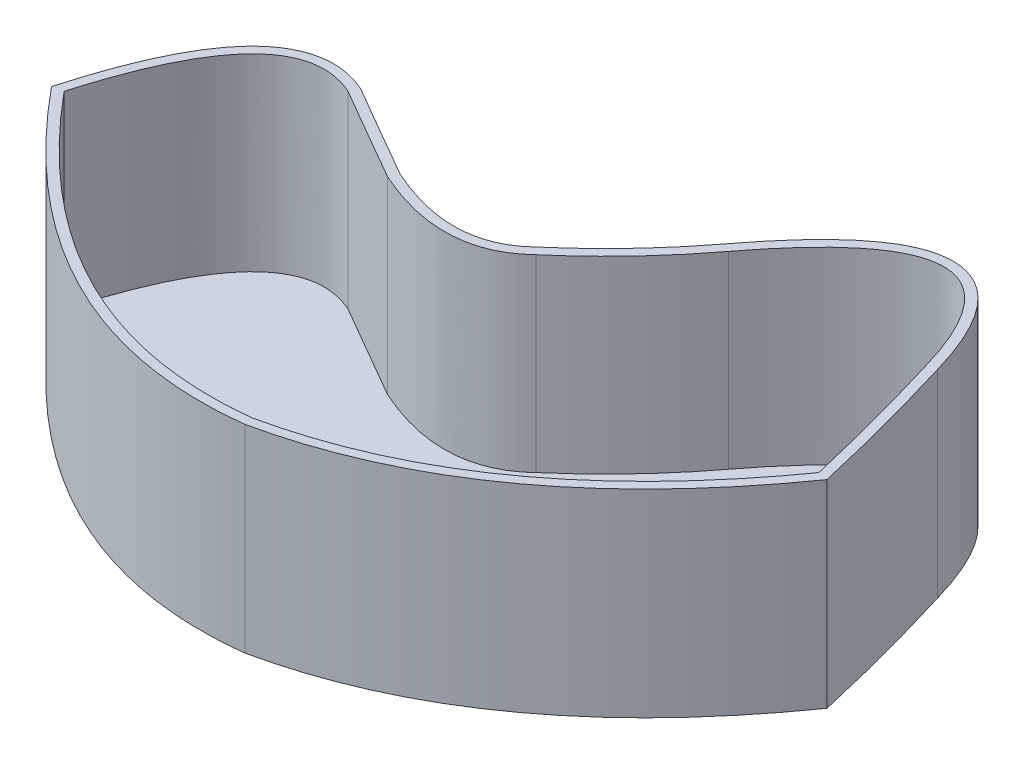
ISO-10303-21;
HEADER;
FILE_DESCRIPTION(('STEP AP214'),'2;1');
FILE_NAME('part.step','',(''),(''),'','','');
FILE_SCHEMA(('AUTOMOTIVE_DESIGN { 1 0 10303 214 1 1 1 1 }'));
ENDSEC;
DATA;
#1=APPLICATION_CONTEXT('core data for automotive mechanical design processes');
#2=APPLICATION_PROTOCOL_DEFINITION('international standard','automotive_design',2000,#1);
#3=PRODUCT_CONTEXT('',#1,'mechanical');
#4=PRODUCT('Part','Part','',(#3));
#5=PRODUCT_RELATED_PRODUCT_CATEGORY('part','',(#4));
#6=PRODUCT_DEFINITION_FORMATION('','',#4);
#7=PRODUCT_DEFINITION_CONTEXT('part definition',#1,'design');
#8=PRODUCT_DEFINITION('design','',#6,#7);
#9=PRODUCT_DEFINITION_SHAPE('','',#8);
#10=(LENGTH_UNIT() NAMED_UNIT(*) SI_UNIT(.MILLI.,.METRE.));
#11=(NAMED_UNIT(*) PLANE_ANGLE_UNIT() SI_UNIT($,.RADIAN.));
#12=(NAMED_UNIT(*) SI_UNIT($,.STERADIAN.) SOLID_ANGLE_UNIT());
#13=UNCERTAINTY_MEASURE_WITH_UNIT(LENGTH_MEASURE(1.E-05),#10,'distance_accuracy_value','');
#14=(GEOMETRIC_REPRESENTATION_CONTEXT(3) GLOBAL_UNCERTAINTY_ASSIGNED_CONTEXT((#13)) GLOBAL_UNIT_ASSIGNED_CONTEXT((#10,
#11,#12)) REPRESENTATION_CONTEXT('',''));
#15=CARTESIAN_POINT('',(0.,0.,0.));
#16=DIRECTION('',(0.,0.,1.));
#17=DIRECTION('',(1.,0.,0.));
#18=AXIS2_PLACEMENT_3D('',#15,#16,#17);
#19=CARTESIAN_POINT('',(0.,2.,0.));
#20=DIRECTION('',(0.,1.,0.));
#21=DIRECTION('',(0.,0.,1.));
#22=AXIS2_PLACEMENT_3D('',#19,#20,#21);
#23=PLANE('',#22);
#24=CARTESIAN_POINT('',(52.7102975288728,2.,-99.5821273022406));
#25=CARTESIAN_POINT('',(63.7565615171171,2.,-138.08159519488));
#26=CARTESIAN_POINT('',(82.7102975288728,2.,-129.735907434836));
#27=B_SPLINE_CURVE_WITH_KNOTS('',2,(#24,#25,#26),.UNSPECIFIED.,.F.,.F.,(3,3),(0.,
0.959481384978957),.UNSPECIFIED.);
#28=CARTESIAN_POINT('',(52.7102975288728,2.,-99.5821273022406));
#29=VERTEX_POINT('',#28);
#30=CARTESIAN_POINT('',(82.7102975288728,2.,-129.735907434836));
#31=VERTEX_POINT('',#30);
#32=EDGE_CURVE('E273',#29,#31,#27,.T.);
#33=ORIENTED_EDGE('',*,*,#32,.F.);
#34=CARTESIAN_POINT('',(52.7102975288728,2.,-99.5821273022406));
#35=CARTESIAN_POINT('',(90.1265450045069,2.,-54.5188498226211));
#36=CARTESIAN_POINT('',(132.710297528873,2.,-59.5821273022406));
#37=B_SPLINE_CURVE_WITH_KNOTS('',2,(#34,#35,#36),.UNSPECIFIED.,.F.,.F.,(3,3),(0.,
0.796718819016944),.UNSPECIFIED.);
#38=CARTESIAN_POINT('',(132.710297528873,2.,-59.5821273022406));
#39=VERTEX_POINT('',#38);
#40=EDGE_CURVE('E174',#29,#39,#37,.T.);
#41=ORIENTED_EDGE('',*,*,#40,.T.);
#42=CARTESIAN_POINT('',(202.710297528873,2.,-109.582127302241));
#43=CARTESIAN_POINT('',(173.420126191462,2.,-68.3584345031443));
#44=CARTESIAN_POINT('',(132.710297528873,2.,-59.5821273022406));
#45=B_SPLINE_CURVE_WITH_KNOTS('',2,(#42,#43,#44),.UNSPECIFIED.,.F.,.F.,(3,3),(0.,
0.720516105858423),.UNSPECIFIED.);
#46=CARTESIAN_POINT('',(202.710297528873,2.,-109.582127302241));
#47=VERTEX_POINT('',#46);
#48=EDGE_CURVE('E289',#47,#39,#45,.T.);
#49=ORIENTED_EDGE('',*,*,#48,.F.);
#50=CARTESIAN_POINT('',(194.454170211636,2.,-140.507214192245));
#51=CARTESIAN_POINT('',(199.136053193213,2.,-125.204121307476));
#52=CARTESIAN_POINT('',(202.710297528873,2.,-109.582127302241));
#53=B_SPLINE_CURVE_WITH_KNOTS('',2,(#50,#51,#52),.UNSPECIFIED.,.F.,.F.,(3,3),(0.,
0.675598466329981),.UNSPECIFIED.);
#54=CARTESIAN_POINT('',(194.454170211636,2.,-140.507214192245));
#55=VERTEX_POINT('',#54);
#56=EDGE_CURVE('E300',#55,#47,#53,.T.);
#57=ORIENTED_EDGE('',*,*,#56,.F.);
#58=CARTESIAN_POINT('',(152.449897531892,2.,-140.507214192245));
#59=CARTESIAN_POINT('',(182.80825642938,2.,-180.784913915142));
#60=CARTESIAN_POINT('',(194.454170211636,2.,-140.507214192245));
#61=B_SPLINE_CURVE_WITH_KNOTS('',2,(#58,#59,#60),.UNSPECIFIED.,.F.,.F.,(3,3),(0.,1.),.UNSPECIFIED.);
#62=CARTESIAN_POINT('',(152.548534787665,2.,-140.637933124063));
#63=VERTEX_POINT('',#62);
#64=EDGE_CURVE('E311',#63,#55,#61,.T.);
#65=ORIENTED_EDGE('',*,*,#64,.F.);
#66=CARTESIAN_POINT('',(132.710297528873,2.,-119.582127302241));
#67=CARTESIAN_POINT('',(140.232557562499,2.,-126.036793661723));
#68=CARTESIAN_POINT('',(146.899075524206,2.,-133.105336410255));
#69=CARTESIAN_POINT('',(152.723864848428,2.,-140.87114118887));
#70=B_SPLINE_CURVE_WITH_KNOTS('',3,(#66,#67,#68,#69),.UNSPECIFIED.,.F.,.F.,(4,4),(0.,
0.847217316518865),.UNSPECIFIED.);
#71=CARTESIAN_POINT('',(132.710297528873,2.,-119.582127302241));
#72=VERTEX_POINT('',#71);
#73=EDGE_CURVE('E65',#72,#63,#70,.T.);
#74=ORIENTED_EDGE('',*,*,#73,.F.);
#75=CARTESIAN_POINT('',(102.658770869961,2.,-118.201219927387));
#76=CARTESIAN_POINT('',(122.100312054826,2.,-109.428474087451));
#77=CARTESIAN_POINT('',(132.710297528873,2.,-119.582127302241));
#78=B_SPLINE_CURVE_WITH_KNOTS('',2,(#75,#76,#77),.UNSPECIFIED.,.F.,.F.,(3,3),(0.,
0.908986228479372),.UNSPECIFIED.);
#79=CARTESIAN_POINT('',(102.65877086812,2.00000000000003,-118.20121992911));
#80=VERTEX_POINT('',#79);
#81=EDGE_CURVE('E53',#80,#72,#78,.T.);
#82=ORIENTED_EDGE('',*,*,#81,.F.);
#83=CARTESIAN_POINT('',(82.7102975288728,2.,-129.735907434836));
#84=CARTESIAN_POINT('',(92.6719977264586,2.,-123.923322823362));
#85=CARTESIAN_POINT('',(102.658770869961,2.,-118.201219927387));
#86=B_SPLINE_CURVE_WITH_KNOTS('',2,(#83,#84,#85),.UNSPECIFIED.,.F.,.F.,(3,3),(0.,
0.910186202076738),.UNSPECIFIED.);
#87=EDGE_CURVE('E11',#31,#80,#86,.T.);
#88=ORIENTED_EDGE('',*,*,#87,.F.);
#89=EDGE_LOOP('',(#33,#41,#49,#57,#65,#74,#82,#88));
#90=FACE_BOUND('',#89,.T.);
#91=ADVANCED_FACE('F41',(#90),#23,.T.);
#92=CARTESIAN_POINT('',(132.710297528873,2.,-119.582127302241));
#93=CARTESIAN_POINT('',(140.232557562499,2.,-126.036793661723));
#94=CARTESIAN_POINT('',(146.899075524206,2.,-133.105336410255));
#95=CARTESIAN_POINT('',(152.723864848428,2.,-140.87114118887));
#96=B_SPLINE_CURVE_WITH_KNOTS('',3,(#92,#93,#94,#95),.UNSPECIFIED.,.F.,.F.,(4,4),(0.,
0.847217316518865),.UNSPECIFIED.);
#97=DIRECTION('',(0.,-1.,0.));
#98=VECTOR('',#97,1.);
#99=SURFACE_OF_LINEAR_EXTRUSION('',#96,#98);
#100=ORIENTED_EDGE('',*,*,#73,.T.);
#101=DIRECTION('',(0.,-1.,0.));
#102=VECTOR('',#101,1.);
#103=CARTESIAN_POINT('',(152.548534830335,42.,-140.637933180685));
#104=LINE('',#103,#102);
#105=CARTESIAN_POINT('',(152.548534830335,42.,-140.637933180685));
#106=VERTEX_POINT('',#105);
#107=EDGE_CURVE('E237',#106,#63,#104,.T.);
#108=ORIENTED_EDGE('',*,*,#107,.F.);
#109=CARTESIAN_POINT('',(152.548534830335,42.,-140.637933180685));
#110=CARTESIAN_POINT('',(151.802445602179,42.,-139.647832276837));
#111=CARTESIAN_POINT('',(151.042097064743,42.,-138.668483436964));
#112=CARTESIAN_POINT('',(149.493737621177,42.,-136.732054909069));
#113=CARTESIAN_POINT('',(148.705729364017,42.,-135.774973103055));
#114=CARTESIAN_POINT('',(147.102766336356,42.,-133.883657139328));
#115=CARTESIAN_POINT('',(146.28781164731,42.,-132.949422912565));
#116=CARTESIAN_POINT('',(144.631799542841,42.,-131.104259493029));
#117=CARTESIAN_POINT('',(143.790740187389,42.,-130.193332041573));
#118=CARTESIAN_POINT('',(142.127652766755,42.,-128.44171216919));
#119=CARTESIAN_POINT('',(141.306885217608,42.,-127.59982212943));
#120=CARTESIAN_POINT('',(139.643666296095,42.,-125.93765412479));
#121=CARTESIAN_POINT('',(138.801213775191,42.,-125.117377309323));
#122=CARTESIAN_POINT('',(137.095420901864,42.,-123.498472427582));
#123=CARTESIAN_POINT('',(136.232076050353,42.,-122.699849104253));
#124=CARTESIAN_POINT('',(134.485713017515,42.,-121.124540698421));
#125=CARTESIAN_POINT('',(133.602696326167,42.,-120.347853964441));
#126=CARTESIAN_POINT('',(132.710297528451,42.,-119.582127301879));
#127=B_SPLINE_CURVE_WITH_KNOTS('',3,(#109,#110,#111,#112,#113,#114,#115,#116,#117,#118,#119,
#120,#121,#122,#123,#124,#125,#126),.UNSPECIFIED.,.F.,.F.,(4,2,2,2,2,2,2,2,4),(0.,
3.71907599562777,7.43779678239728,11.156506329176,14.8754929053739,18.4024064753611,
21.929507233285,25.457374420502,28.9849753036542),.UNSPECIFIED.);
#128=CARTESIAN_POINT('',(132.710297528451,42.,-119.582127301879));
#129=VERTEX_POINT('',#128);
#130=EDGE_CURVE('E229',#106,#129,#127,.T.);
#131=ORIENTED_EDGE('',*,*,#130,.T.);
#132=DIRECTION('',(0.,-1.,0.));
#133=VECTOR('',#132,1.);
#134=CARTESIAN_POINT('',(132.710297528451,42.,-119.582127301879));
#135=LINE('',#134,#133);
#136=EDGE_CURVE('E243',#129,#72,#135,.T.);
#137=ORIENTED_EDGE('',*,*,#136,.T.);
#138=EDGE_LOOP('',(#100,#108,#131,#137));
#139=FACE_BOUND('',#138,.T.);
#140=ADVANCED_FACE('F210',(#139),#99,.F.);
#141=CARTESIAN_POINT('',(64.1471801688148,42.,-127.610015185249));
#142=DIRECTION('',(0.,-1.,0.));
#143=DIRECTION('',(0.,0.,-1.));
#144=AXIS2_PLACEMENT_3D('',#141,#142,#143);
#145=PLANE('',#144);
#146=CARTESIAN_POINT('',(83.6223686497557,42.,-131.519291557919));
#147=CARTESIAN_POINT('',(83.1905642371699,42.,-131.711951172056));
#148=CARTESIAN_POINT('',(82.3062218461977,42.,-132.074777827628));
#149=CARTESIAN_POINT('',(80.5656106317789,42.,-132.658261640751));
#150=CARTESIAN_POINT('',(78.3909630079155,42.,-133.138657798905));
#151=CARTESIAN_POINT('',(75.8090048681134,42.,-133.290414790726));
#152=CARTESIAN_POINT('',(72.4281554164113,42.,-132.910719976621));
#153=CARTESIAN_POINT('',(68.4091878702199,42.,-131.33794906131));
#154=CARTESIAN_POINT('',(64.0744050334714,42.,-127.853972923409));
#155=CARTESIAN_POINT('',(60.1762730087832,42.,-122.906250356549));
#156=CARTESIAN_POINT('',(57.2252212595313,42.,-117.581734073141));
#157=CARTESIAN_POINT('',(55.0189230324032,42.,-112.595164449759));
#158=CARTESIAN_POINT('',(53.4386849011051,42.,-108.492028221701));
#159=CARTESIAN_POINT('',(52.1794640559504,42.,-104.761070861549));
#160=CARTESIAN_POINT('',(51.210491314772,42.,-101.605518316375));
#161=CARTESIAN_POINT('',(50.7305901057803,42.,-99.9417759866544));
#162=CARTESIAN_POINT('',(50.4999983627078,42.,-99.1178278572847));
#163=B_SPLINE_CURVE_WITH_KNOTS('',3,(#146,#147,#148,#149,#150,#151,#152,#153,#154,#155,#156,
#157,#158,#159,#160,#161,#162),.UNSPECIFIED.,.F.,.F.,(4,1,1,1,1,1,1,1,1,1,1,1,1,1,4),
(0.499165355288542,0.499274720322278,0.499384085356013,0.499602815423484,0.499821545490955,
0.500040275558426,0.500477735693368,0.500915195828309,0.501352655963251,0.501790116098193,
0.502008846165664,0.502227576233135,0.502446306300606,0.502555671334341,0.502665036368077),.UNSPECIFIED.);
#164=CARTESIAN_POINT('',(83.6223686497568,42.,-131.519291557923));
#165=VERTEX_POINT('',#164);
#166=CARTESIAN_POINT('',(50.4999983627065,42.,-99.1178278573262));
#167=VERTEX_POINT('',#166);
#168=EDGE_CURVE('E381',#165,#167,#163,.T.);
#169=ORIENTED_EDGE('',*,*,#168,.T.);
#170=CARTESIAN_POINT('',(50.4999983627065,42.,-99.1178278573262));
#171=CARTESIAN_POINT('',(51.2871385095808,42.,-98.1592657074977));
#172=CARTESIAN_POINT('',(52.8904782275385,42.,-96.2446064374934));
#173=CARTESIAN_POINT('',(56.086666196391,42.,-92.5796612140465));
#174=CARTESIAN_POINT('',(60.1208782432729,42.,-88.2356262496104));
#175=CARTESIAN_POINT('',(65.0067627466777,42.,-83.42490569573));
#176=CARTESIAN_POINT('',(71.5885960424948,42.,-77.5396184956844));
#177=CARTESIAN_POINT('',(79.9411055012469,42.,-71.1803574213744));
#178=CARTESIAN_POINT('',(90.169736046492,42.,-65.1529280319817));
#179=CARTESIAN_POINT('',(100.604072147197,42.,-60.7426020728711));
#180=CARTESIAN_POINT('',(111.233689737779,42.,-57.9634006666847));
#181=CARTESIAN_POINT('',(120.247602029759,42.,-57.0166033059108));
#182=CARTESIAN_POINT('',(127.525650081559,42.,-57.0798075757186));
#183=CARTESIAN_POINT('',(131.212661014564,42.,-57.3877535262484));
#184=CARTESIAN_POINT('',(133.039987072099,42.,-57.6072981213154));
#185=B_SPLINE_CURVE_WITH_KNOTS('',3,(#170,#171,#172,#173,#174,#175,#176,#177,#178,#179,#180,
#181,#182,#183,#184),.UNSPECIFIED.,.F.,.F.,(4,1,1,1,1,1,1,1,1,1,1,1,4),(0.497081408104608,
0.497193430438865,0.497305452773121,0.497529497441634,0.497753542110146,0.497977586778659,
0.498425676115684,0.49887376545271,0.499321854789735,0.49976994412676,0.500218033463785,
0.500442078132298,0.500666122800811),.UNSPECIFIED.);
#186=CARTESIAN_POINT('',(133.039987072047,42.,-57.6072981213089));
#187=VERTEX_POINT('',#186);
#188=EDGE_CURVE('E387',#167,#187,#185,.T.);
#189=ORIENTED_EDGE('',*,*,#188,.T.);
#190=CARTESIAN_POINT('',(133.039987072047,42.,-57.6072981213089));
#191=CARTESIAN_POINT('',(136.517017027201,42.,-58.3535882392313));
#192=CARTESIAN_POINT('',(143.410304060794,42.,-60.2112083609277));
#193=CARTESIAN_POINT('',(153.331921439384,42.,-64.0427931558047));
#194=CARTESIAN_POINT('',(162.890265106326,42.,-68.9298100648091));
#195=CARTESIAN_POINT('',(172.064001951506,42.,-74.8641942528799));
#196=CARTESIAN_POINT('',(180.854741647861,42.,-81.8417029820189));
#197=CARTESIAN_POINT('',(187.85941483952,42.,-88.5209707614898));
#198=CARTESIAN_POINT('',(193.271403671896,42.,-94.3814528437911));
#199=CARTESIAN_POINT('',(197.23409716682,42.,-99.034056041112));
#200=CARTESIAN_POINT('',(200.458372671881,42.,-103.128234116171));
#201=CARTESIAN_POINT('',(202.986483638305,42.,-106.52699965526));
#202=CARTESIAN_POINT('',(204.241393683951,42.,-108.278784185381));
#203=CARTESIAN_POINT('',(204.858492637616,42.,-109.156288537197));
#204=B_SPLINE_CURVE_WITH_KNOTS('',3,(#190,#191,#192,#193,#194,#195,#196,#197,#198,#199,#200,
#201,#202,#203),.UNSPECIFIED.,.F.,.F.,(4,1,1,1,1,1,1,1,1,1,1,4),(0.499550345325817,
0.499920524035514,0.500290702745211,0.500660881454908,0.501031060164605,0.501401238874302,
0.501771417583999,0.501956506938847,0.502141596293696,0.502326685648544,0.502419230325969,
0.502511775003393),.UNSPECIFIED.);
#205=CARTESIAN_POINT('',(204.858492637598,42.,-109.156288537215));
#206=VERTEX_POINT('',#205);
#207=EDGE_CURVE('E398',#187,#206,#204,.T.);
#208=ORIENTED_EDGE('',*,*,#207,.T.);
#209=CARTESIAN_POINT('',(204.858492637598,42.,-109.156288537215));
#210=CARTESIAN_POINT('',(204.249367291478,42.,-111.84323618215));
#211=CARTESIAN_POINT('',(202.981172006881,42.,-117.207552496459));
#212=CARTESIAN_POINT('',(200.932884689817,42.,-125.208306825836));
#213=CARTESIAN_POINT('',(198.737658449575,42.,-133.167598608148));
#214=CARTESIAN_POINT('',(197.176202956392,42.,-138.445971282278));
#215=CARTESIAN_POINT('',(196.371161117958,42.,-141.077635904324));
#216=B_SPLINE_CURVE_WITH_KNOTS('',3,(#209,#210,#211,#212,#213,#214,#215),.UNSPECIFIED.,.F.,.F.,
(4,1,1,1,4),(0.499571789266591,0.499709653308631,0.499847517350672,0.499985381392713,
0.500123245434754),.UNSPECIFIED.);
#217=CARTESIAN_POINT('',(196.371161117936,42.,-141.077635904313));
#218=VERTEX_POINT('',#217);
#219=EDGE_CURVE('E407',#206,#218,#216,.T.);
#220=ORIENTED_EDGE('',*,*,#219,.T.);
#221=CARTESIAN_POINT('',(196.371161117936,42.,-141.077635904313));
#222=CARTESIAN_POINT('',(196.248795755269,42.,-141.50056384089));
#223=CARTESIAN_POINT('',(195.995397251858,42.,-142.352285228984));
#224=CARTESIAN_POINT('',(195.480738959566,42.,-143.986147770877));
#225=CARTESIAN_POINT('',(194.809972535753,42.,-145.941130104953));
#226=CARTESIAN_POINT('',(193.963876481199,42.,-148.134691236124));
#227=CARTESIAN_POINT('',(192.777490455469,42.,-150.861896982736));
#228=CARTESIAN_POINT('',(191.181073359877,42.,-153.901083063855));
#229=CARTESIAN_POINT('',(188.359000505138,42.,-157.974905620745));
#230=CARTESIAN_POINT('',(184.238162705688,42.,-161.603811096839));
#231=CARTESIAN_POINT('',(178.22170082443,42.,-163.150703065188));
#232=CARTESIAN_POINT('',(172.928136269904,42.,-161.916340061774));
#233=CARTESIAN_POINT('',(168.615333395441,42.,-159.654290079305));
#234=CARTESIAN_POINT('',(165.303845352585,42.,-157.336157380953));
#235=CARTESIAN_POINT('',(161.897909374112,42.,-154.406523973123));
#236=CARTESIAN_POINT('',(158.966988471132,42.,-151.456103513757));
#237=CARTESIAN_POINT('',(156.561279242066,42.,-148.789333407165));
#238=CARTESIAN_POINT('',(154.726138360306,42.,-146.636533397369));
#239=CARTESIAN_POINT('',(153.168453013763,42.,-144.71238731094));
#240=CARTESIAN_POINT('',(151.909452091243,42.,-143.100825643676));
#241=CARTESIAN_POINT('',(151.2679423636,42.,-142.260777117612));
#242=CARTESIAN_POINT('',(150.951990889616,42.,-141.842528057172));
#243=B_SPLINE_CURVE_WITH_KNOTS('',3,(#221,#222,#223,#224,#225,#226,#227,#228,#229,#230,#231,
#232,#233,#234,#235,#236,#237,#238,#239,#240,#241,#242),.UNSPECIFIED.,.F.,.F.,(4,1,1,1,1,1,1,1,
1,1,1,1,1,1,1,1,1,1,1,4),(0.4979886090954,0.498059528209353,0.498130447323305,0.49827228555121,
0.498414123779115,0.49855596200702,0.49883963846283,0.499123314918639,0.499690667830259,
0.500258020741879,0.500825373653498,0.501109050109308,0.501392726565118,0.501676403020928,
0.501960079476738,0.502101917704643,0.502243755932547,0.502385594160452,0.502456513274405,
0.502527432388357),.UNSPECIFIED.);
#244=CARTESIAN_POINT('',(150.951990889615,42.,-141.842528057165));
#245=VERTEX_POINT('',#244);
#246=EDGE_CURVE('E430',#218,#245,#243,.T.);
#247=ORIENTED_EDGE('',*,*,#246,.T.);
#248=CARTESIAN_POINT('',(150.951990889615,42.,-141.842528057165));
#249=CARTESIAN_POINT('',(149.526755213029,42.,-139.951249583469));
#250=CARTESIAN_POINT('',(146.571479335493,42.,-136.248825132813));
#251=CARTESIAN_POINT('',(141.830479533851,42.,-130.941084133425));
#252=CARTESIAN_POINT('',(136.787475180571,42.,-125.87523429708));
#253=CARTESIAN_POINT('',(133.194243870321,42.,-122.632759491284));
#254=CARTESIAN_POINT('',(131.365719964848,42.,-121.063748092129));
#255=B_SPLINE_CURVE_WITH_KNOTS('',3,(#248,#249,#250,#251,#252,#253,#254),.UNSPECIFIED.,.F.,.F.,
(4,1,1,1,4),(-3.40698846867364E-05,0.210052577125725,0.420139224136137,0.630225871146549,
0.840312518156961),.UNSPECIFIED.);
#256=CARTESIAN_POINT('',(131.365719964841,42.,-121.063748092142));
#257=VERTEX_POINT('',#256);
#258=EDGE_CURVE('E435',#245,#257,#255,.T.);
#259=ORIENTED_EDGE('',*,*,#258,.T.);
#260=CARTESIAN_POINT('',(131.365719964841,42.,-121.063748092142));
#261=CARTESIAN_POINT('',(130.971888683273,42.,-120.68483536333));
#262=CARTESIAN_POINT('',(130.142632132553,42.,-119.951792799679));
#263=CARTESIAN_POINT('',(128.43878491224,42.,-118.697522101995));
#264=CARTESIAN_POINT('',(126.162778493761,42.,-117.462528486742));
#265=CARTESIAN_POINT('',(123.183412129064,42.,-116.506911997859));
#266=CARTESIAN_POINT('',(119.912471768881,42.,-116.071224683974));
#267=CARTESIAN_POINT('',(116.324809267525,42.,-116.17275921779));
#268=CARTESIAN_POINT('',(113.063366868133,42.,-116.722196559514));
#269=CARTESIAN_POINT('',(110.292203949812,42.,-117.449231612332));
#270=CARTESIAN_POINT('',(108.134536322264,42.,-118.139339847328));
#271=CARTESIAN_POINT('',(106.268418781651,42.,-118.837388440887));
#272=CARTESIAN_POINT('',(104.741437098564,42.,-119.467238276267));
#273=CARTESIAN_POINT('',(103.956054979901,42.,-119.810793101047));
#274=CARTESIAN_POINT('',(103.568713537178,42.,-119.984885531753));
#275=B_SPLINE_CURVE_WITH_KNOTS('',3,(#260,#261,#262,#263,#264,#265,#266,#267,#268,#269,#270,
#271,#272,#273,#274),.UNSPECIFIED.,.F.,.F.,(4,1,1,1,1,1,1,1,1,1,1,1,4),(0.499479639278908,
0.499622406419459,0.499765173560009,0.500050707841109,0.500336242122209,0.500621776403309,
0.50090731068441,0.50119284496551,0.50133561210606,0.50147837924661,0.50162114638716,
0.501692529957435,0.50176391352771),.UNSPECIFIED.);
#276=CARTESIAN_POINT('',(103.568713537174,42.,-119.984885531751));
#277=VERTEX_POINT('',#276);
#278=EDGE_CURVE('E444',#257,#277,#275,.T.);
#279=ORIENTED_EDGE('',*,*,#278,.T.);
#280=CARTESIAN_POINT('',(1555.01901988355,42.,-2652.97860271237));
#281=DIRECTION('',(0.,-1.,0.));
#282=DIRECTION('',(0.,0.,1.));
#283=AXIS2_PLACEMENT_3D('',#280,#281,#282);
#284=CIRCLE('',#283,2919.37753006861);
#285=EDGE_CURVE('E453',#277,#165,#284,.T.);
#286=ORIENTED_EDGE('',*,*,#285,.T.);
#287=EDGE_LOOP('',(#169,#189,#208,#220,#247,#259,#279,#286));
#288=FACE_BOUND('',#287,.T.);
#289=CARTESIAN_POINT('',(171469.560371562,42.,985084.052350952));
#290=CARTESIAN_POINT('',(-166371.473549672,42.,-986181.692215219));
#291=CARTESIAN_POINT('',(161569.709898963,42.,986755.149171068));
#292=B_SPLINE_CURVE_WITH_KNOTS('',2,(#289,#290,#291),.UNSPECIFIED.,.F.,.F.,(3,3),(0.,1.),.UNSPECIFIED.);
#293=CARTESIAN_POINT('',(82.7102975395415,42.,-129.735907429281));
#294=VERTEX_POINT('',#293);
#295=CARTESIAN_POINT('',(52.7102974970926,42.,-99.5821271954078));
#296=VERTEX_POINT('',#295);
#297=EDGE_CURVE('E157',#294,#296,#292,.T.);
#298=ORIENTED_EDGE('',*,*,#297,.F.);
#299=CARTESIAN_POINT('',(1555.01901988355,42.,-2652.97860271237));
#300=DIRECTION('',(0.,-1.,0.));
#301=DIRECTION('',(0.,0.,1.));
#302=AXIS2_PLACEMENT_3D('',#299,#300,#301);
#303=CIRCLE('',#302,2921.3775300686);
#304=CARTESIAN_POINT('',(102.65877086812,42.,-118.20121992911));
#305=VERTEX_POINT('',#304);
#306=EDGE_CURVE('E568',#305,#294,#303,.T.);
#307=ORIENTED_EDGE('',*,*,#306,.F.);
#308=CARTESIAN_POINT('',(-417212.232014898,42.,-908886.902052155));
#309=CARTESIAN_POINT('',(422982.902479063,42.,906081.192329502));
#310=CARTESIAN_POINT('',(-428243.692828445,42.,-903739.332223111));
#311=B_SPLINE_CURVE_WITH_KNOTS('',2,(#308,#309,#310),.UNSPECIFIED.,.F.,.F.,(3,3),(0.,1.),.UNSPECIFIED.);
#312=EDGE_CURVE('E342',#129,#305,#311,.T.);
#313=ORIENTED_EDGE('',*,*,#312,.F.);
#314=ORIENTED_EDGE('',*,*,#130,.F.);
#315=CARTESIAN_POINT('',(-221705.435248704,42.,974922.632718717));
#316=CARTESIAN_POINT('',(226448.839390606,42.,-974225.383273792));
#317=CARTESIAN_POINT('',(-230470.315502225,42.,972886.613509403));
#318=B_SPLINE_CURVE_WITH_KNOTS('',2,(#315,#316,#317),.UNSPECIFIED.,.F.,.F.,(3,3),(0.,1.),.UNSPECIFIED.);
#319=CARTESIAN_POINT('',(194.454170208719,42.,-140.507214202354));
#320=VERTEX_POINT('',#319);
#321=EDGE_CURVE('E337',#320,#106,#318,.T.);
#322=ORIENTED_EDGE('',*,*,#321,.F.);
#323=CARTESIAN_POINT('',(-952520.80048615,42.,305183.060478471));
#324=CARTESIAN_POINT('',(961160.956647723,42.,-276805.472817539));
#325=CARTESIAN_POINT('',(-969014.913387312,42.,247894.089989147));
#326=B_SPLINE_CURVE_WITH_KNOTS('',2,(#323,#324,#325),.UNSPECIFIED.,.F.,.F.,(3,3),(0.,1.),.UNSPECIFIED.);
#327=CARTESIAN_POINT('',(202.710297598447,42.,-109.582127358592));
#328=VERTEX_POINT('',#327);
#329=EDGE_CURVE('E186',#328,#320,#326,.T.);
#330=ORIENTED_EDGE('',*,*,#329,.F.);
#331=CARTESIAN_POINT('',(-345128.055884112,42.,-938671.078291787));
#332=CARTESIAN_POINT('',(332128.258667466,42.,943222.215798021));
#333=CARTESIAN_POINT('',(-318549.100961201,42.,-948025.377619309));
#334=B_SPLINE_CURVE_WITH_KNOTS('',2,(#331,#332,#333),.UNSPECIFIED.,.F.,.F.,(3,3),(0.,1.),.UNSPECIFIED.);
#335=CARTESIAN_POINT('',(132.710297600652,42.,-59.5821273063394));
#336=VERTEX_POINT('',#335);
#337=EDGE_CURVE('E182',#336,#328,#334,.T.);
#338=ORIENTED_EDGE('',*,*,#337,.F.);
#339=CARTESIAN_POINT('',(90936.8477882322,42.,-995996.54034882));
#340=CARTESIAN_POINT('',(-102428.718431917,42.,994668.854677358));
#341=CARTESIAN_POINT('',(114388.57976636,42.,-993578.920715932));
#342=B_SPLINE_CURVE_WITH_KNOTS('',2,(#339,#340,#341),.UNSPECIFIED.,.F.,.F.,(3,3),(0.,1.),.UNSPECIFIED.);
#343=EDGE_CURVE('E167',#296,#336,#342,.T.);
#344=ORIENTED_EDGE('',*,*,#343,.F.);
#345=EDGE_LOOP('',(#298,#307,#313,#314,#322,#330,#338,#344));
#346=FACE_BOUND('',#345,.T.);
#347=ADVANCED_FACE('F180',(#288,#346),#145,.F.);
#348=DIRECTION('',(0.,-1.,0.));
#349=VECTOR('',#348,1.);
#350=SURFACE_OF_LINEAR_EXTRUSION('',#163,#349);
#351=CARTESIAN_POINT('',(83.6223686497557,0.,-131.519291557919));
#352=CARTESIAN_POINT('',(83.1905642371699,0.,-131.711951172056));
#353=CARTESIAN_POINT('',(82.3062218461977,0.,-132.074777827628));
#354=CARTESIAN_POINT('',(80.5656106317789,0.,-132.658261640751));
#355=CARTESIAN_POINT('',(78.3909630079155,0.,-133.138657798905));
#356=CARTESIAN_POINT('',(75.8090048681134,0.,-133.290414790726));
#357=CARTESIAN_POINT('',(72.4281554164113,0.,-132.910719976621));
#358=CARTESIAN_POINT('',(68.4091878702199,0.,-131.33794906131));
#359=CARTESIAN_POINT('',(64.0744050334714,0.,-127.853972923409));
#360=CARTESIAN_POINT('',(60.1762730087832,0.,-122.906250356549));
#361=CARTESIAN_POINT('',(57.2252212595313,0.,-117.581734073141));
#362=CARTESIAN_POINT('',(55.0189230324032,0.,-112.595164449759));
#363=CARTESIAN_POINT('',(53.4386849011051,0.,-108.492028221701));
#364=CARTESIAN_POINT('',(52.1794640559504,0.,-104.761070861549));
#365=CARTESIAN_POINT('',(51.210491314772,0.,-101.605518316375));
#366=CARTESIAN_POINT('',(50.7305901057803,0.,-99.9417759866544));
#367=CARTESIAN_POINT('',(50.4999983627078,0.,-99.1178278572847));
#368=B_SPLINE_CURVE_WITH_KNOTS('',3,(#351,#352,#353,#354,#355,#356,#357,#358,#359,#360,#361,
#362,#363,#364,#365,#366,#367),.UNSPECIFIED.,.F.,.F.,(4,1,1,1,1,1,1,1,1,1,1,1,1,1,4),
(0.499165355288542,0.499274720322278,0.499384085356013,0.499602815423484,0.499821545490955,
0.500040275558426,0.500477735693368,0.500915195828309,0.501352655963251,0.501790116098193,
0.502008846165664,0.502227576233135,0.502446306300606,0.502555671334341,0.502665036368077),.UNSPECIFIED.);
#369=CARTESIAN_POINT('',(83.6223686497568,0.,-131.519291557923));
#370=VERTEX_POINT('',#369);
#371=CARTESIAN_POINT('',(50.4999983627065,0.,-99.1178278573262));
#372=VERTEX_POINT('',#371);
#373=EDGE_CURVE('E176',#370,#372,#368,.T.);
#374=ORIENTED_EDGE('',*,*,#373,.T.);
#375=DIRECTION('',(0.,-1.,0.));
#376=VECTOR('',#375,1.);
#377=CARTESIAN_POINT('',(50.4999983627065,42.,-99.1178278573262));
#378=LINE('',#377,#376);
#379=EDGE_CURVE('E279',#167,#372,#378,.T.);
#380=ORIENTED_EDGE('',*,*,#379,.F.);
#381=ORIENTED_EDGE('',*,*,#168,.F.);
#382=DIRECTION('',(0.,-1.,0.));
#383=VECTOR('',#382,1.);
#384=CARTESIAN_POINT('',(83.6223686497568,42.,-131.519291557923));
#385=LINE('',#384,#383);
#386=EDGE_CURVE('E470',#165,#370,#385,.T.);
#387=ORIENTED_EDGE('',*,*,#386,.T.);
#388=EDGE_LOOP('',(#374,#380,#381,#387));
#389=FACE_BOUND('',#388,.T.);
#390=ADVANCED_FACE('F373',(#389),#350,.F.);
#391=DIRECTION('',(0.,-1.,0.));
#392=VECTOR('',#391,1.);
#393=SURFACE_OF_LINEAR_EXTRUSION('',#185,#392);
#394=CARTESIAN_POINT('',(50.4999983627065,0.,-99.1178278573262));
#395=CARTESIAN_POINT('',(51.2871385095808,0.,-98.1592657074977));
#396=CARTESIAN_POINT('',(52.8904782275385,0.,-96.2446064374934));
#397=CARTESIAN_POINT('',(56.086666196391,0.,-92.5796612140465));
#398=CARTESIAN_POINT('',(60.1208782432729,0.,-88.2356262496104));
#399=CARTESIAN_POINT('',(65.0067627466777,0.,-83.42490569573));
#400=CARTESIAN_POINT('',(71.5885960424948,0.,-77.5396184956844));
#401=CARTESIAN_POINT('',(79.9411055012469,0.,-71.1803574213744));
#402=CARTESIAN_POINT('',(90.169736046492,0.,-65.1529280319817));
#403=CARTESIAN_POINT('',(100.604072147197,0.,-60.7426020728711));
#404=CARTESIAN_POINT('',(111.233689737779,0.,-57.9634006666847));
#405=CARTESIAN_POINT('',(120.247602029759,0.,-57.0166033059108));
#406=CARTESIAN_POINT('',(127.525650081559,0.,-57.0798075757186));
#407=CARTESIAN_POINT('',(131.212661014564,0.,-57.3877535262484));
#408=CARTESIAN_POINT('',(133.039987072099,0.,-57.6072981213154));
#409=B_SPLINE_CURVE_WITH_KNOTS('',3,(#394,#395,#396,#397,#398,#399,#400,#401,#402,#403,#404,
#405,#406,#407,#408),.UNSPECIFIED.,.F.,.F.,(4,1,1,1,1,1,1,1,1,1,1,1,4),(0.497081408104608,
0.497193430438865,0.497305452773121,0.497529497441634,0.497753542110146,0.497977586778659,
0.498425676115684,0.49887376545271,0.499321854789735,0.49976994412676,0.500218033463785,
0.500442078132298,0.500666122800811),.UNSPECIFIED.);
#410=CARTESIAN_POINT('',(133.039987072047,0.,-57.6072981213089));
#411=VERTEX_POINT('',#410);
#412=EDGE_CURVE('E485',#372,#411,#409,.T.);
#413=ORIENTED_EDGE('',*,*,#412,.T.);
#414=DIRECTION('',(0.,-1.,0.));
#415=VECTOR('',#414,1.);
#416=CARTESIAN_POINT('',(133.039987072047,42.,-57.6072981213089));
#417=LINE('',#416,#415);
#418=EDGE_CURVE('E558',#187,#411,#417,.T.);
#419=ORIENTED_EDGE('',*,*,#418,.F.);
#420=ORIENTED_EDGE('',*,*,#188,.F.);
#421=ORIENTED_EDGE('',*,*,#379,.T.);
#422=EDGE_LOOP('',(#413,#419,#420,#421));
#423=FACE_BOUND('',#422,.T.);
#424=ADVANCED_FACE('F377',(#423),#393,.F.);
#425=DIRECTION('',(0.,-1.,0.));
#426=VECTOR('',#425,1.);
#427=SURFACE_OF_LINEAR_EXTRUSION('',#204,#426);
#428=CARTESIAN_POINT('',(133.039987072047,0.,-57.6072981213089));
#429=CARTESIAN_POINT('',(136.517017027201,0.,-58.3535882392313));
#430=CARTESIAN_POINT('',(143.410304060794,0.,-60.2112083609277));
#431=CARTESIAN_POINT('',(153.331921439384,0.,-64.0427931558047));
#432=CARTESIAN_POINT('',(162.890265106326,0.,-68.9298100648091));
#433=CARTESIAN_POINT('',(172.064001951506,0.,-74.8641942528799));
#434=CARTESIAN_POINT('',(180.854741647861,0.,-81.8417029820189));
#435=CARTESIAN_POINT('',(187.85941483952,0.,-88.5209707614898));
#436=CARTESIAN_POINT('',(193.271403671896,0.,-94.3814528437911));
#437=CARTESIAN_POINT('',(197.23409716682,0.,-99.034056041112));
#438=CARTESIAN_POINT('',(200.458372671881,0.,-103.128234116171));
#439=CARTESIAN_POINT('',(202.986483638305,0.,-106.52699965526));
#440=CARTESIAN_POINT('',(204.241393683951,0.,-108.278784185381));
#441=CARTESIAN_POINT('',(204.858492637616,0.,-109.156288537197));
#442=B_SPLINE_CURVE_WITH_KNOTS('',3,(#428,#429,#430,#431,#432,#433,#434,#435,#436,#437,#438,
#439,#440,#441),.UNSPECIFIED.,.F.,.F.,(4,1,1,1,1,1,1,1,1,1,1,4),(0.499550345325817,
0.499920524035514,0.500290702745211,0.500660881454908,0.501031060164605,0.501401238874302,
0.501771417583999,0.501956506938847,0.502141596293696,0.502326685648544,0.502419230325969,
0.502511775003393),.UNSPECIFIED.);
#443=CARTESIAN_POINT('',(204.858492637598,0.,-109.156288537215));
#444=VERTEX_POINT('',#443);
#445=EDGE_CURVE('E489',#411,#444,#442,.T.);
#446=ORIENTED_EDGE('',*,*,#445,.T.);
#447=DIRECTION('',(0.,-1.,0.));
#448=VECTOR('',#447,1.);
#449=CARTESIAN_POINT('',(204.858492637598,42.,-109.156288537215));
#450=LINE('',#449,#448);
#451=EDGE_CURVE('E554',#206,#444,#450,.T.);
#452=ORIENTED_EDGE('',*,*,#451,.F.);
#453=ORIENTED_EDGE('',*,*,#207,.F.);
#454=ORIENTED_EDGE('',*,*,#418,.T.);
#455=EDGE_LOOP('',(#446,#452,#453,#454));
#456=FACE_BOUND('',#455,.T.);
#457=ADVANCED_FACE('F415',(#456),#427,.F.);
#458=DIRECTION('',(0.,-1.,0.));
#459=VECTOR('',#458,1.);
#460=SURFACE_OF_LINEAR_EXTRUSION('',#216,#459);
#461=CARTESIAN_POINT('',(204.858492637598,0.,-109.156288537215));
#462=CARTESIAN_POINT('',(204.249367291478,0.,-111.84323618215));
#463=CARTESIAN_POINT('',(202.981172006881,0.,-117.207552496459));
#464=CARTESIAN_POINT('',(200.932884689817,0.,-125.208306825836));
#465=CARTESIAN_POINT('',(198.737658449575,0.,-133.167598608148));
#466=CARTESIAN_POINT('',(197.176202956392,0.,-138.445971282278));
#467=CARTESIAN_POINT('',(196.371161117958,0.,-141.077635904324));
#468=B_SPLINE_CURVE_WITH_KNOTS('',3,(#461,#462,#463,#464,#465,#466,#467),.UNSPECIFIED.,.F.,.F.,
(4,1,1,1,4),(0.499571789266591,0.499709653308631,0.499847517350672,0.499985381392713,
0.500123245434754),.UNSPECIFIED.);
#469=CARTESIAN_POINT('',(196.371161117936,0.,-141.077635904313));
#470=VERTEX_POINT('',#469);
#471=EDGE_CURVE('E506',#444,#470,#468,.T.);
#472=ORIENTED_EDGE('',*,*,#471,.T.);
#473=DIRECTION('',(0.,-1.,0.));
#474=VECTOR('',#473,1.);
#475=CARTESIAN_POINT('',(196.371161117936,42.,-141.077635904313));
#476=LINE('',#475,#474);
#477=EDGE_CURVE('E550',#218,#470,#476,.T.);
#478=ORIENTED_EDGE('',*,*,#477,.F.);
#479=ORIENTED_EDGE('',*,*,#219,.F.);
#480=ORIENTED_EDGE('',*,*,#451,.T.);
#481=EDGE_LOOP('',(#472,#478,#479,#480));
#482=FACE_BOUND('',#481,.T.);
#483=ADVANCED_FACE('F418',(#482),#460,.F.);
#484=DIRECTION('',(0.,-1.,0.));
#485=VECTOR('',#484,1.);
#486=SURFACE_OF_LINEAR_EXTRUSION('',#243,#485);
#487=CARTESIAN_POINT('',(196.371161117936,0.,-141.077635904313));
#488=CARTESIAN_POINT('',(196.248795755269,0.,-141.50056384089));
#489=CARTESIAN_POINT('',(195.995397251858,0.,-142.352285228984));
#490=CARTESIAN_POINT('',(195.480738959566,0.,-143.986147770877));
#491=CARTESIAN_POINT('',(194.809972535753,0.,-145.941130104953));
#492=CARTESIAN_POINT('',(193.963876481199,0.,-148.134691236124));
#493=CARTESIAN_POINT('',(192.777490455469,0.,-150.861896982736));
#494=CARTESIAN_POINT('',(191.181073359877,0.,-153.901083063855));
#495=CARTESIAN_POINT('',(188.359000505138,0.,-157.974905620745));
#496=CARTESIAN_POINT('',(184.238162705688,0.,-161.603811096839));
#497=CARTESIAN_POINT('',(178.22170082443,0.,-163.150703065188));
#498=CARTESIAN_POINT('',(172.928136269904,0.,-161.916340061774));
#499=CARTESIAN_POINT('',(168.615333395441,0.,-159.654290079305));
#500=CARTESIAN_POINT('',(165.303845352585,0.,-157.336157380953));
#501=CARTESIAN_POINT('',(161.897909374112,0.,-154.406523973123));
#502=CARTESIAN_POINT('',(158.966988471132,0.,-151.456103513757));
#503=CARTESIAN_POINT('',(156.561279242066,0.,-148.789333407165));
#504=CARTESIAN_POINT('',(154.726138360306,0.,-146.636533397369));
#505=CARTESIAN_POINT('',(153.168453013763,0.,-144.71238731094));
#506=CARTESIAN_POINT('',(151.909452091243,0.,-143.100825643676));
#507=CARTESIAN_POINT('',(151.2679423636,0.,-142.260777117612));
#508=CARTESIAN_POINT('',(150.951990889616,0.,-141.842528057172));
#509=B_SPLINE_CURVE_WITH_KNOTS('',3,(#487,#488,#489,#490,#491,#492,#493,#494,#495,#496,#497,
#498,#499,#500,#501,#502,#503,#504,#505,#506,#507,#508),.UNSPECIFIED.,.F.,.F.,(4,1,1,1,1,1,1,1,
1,1,1,1,1,1,1,1,1,1,1,4),(0.4979886090954,0.498059528209353,0.498130447323305,0.49827228555121,
0.498414123779115,0.49855596200702,0.49883963846283,0.499123314918639,0.499690667830259,
0.500258020741879,0.500825373653498,0.501109050109308,0.501392726565118,0.501676403020928,
0.501960079476738,0.502101917704643,0.502243755932547,0.502385594160452,0.502456513274405,
0.502527432388357),.UNSPECIFIED.);
#510=CARTESIAN_POINT('',(150.951990889615,0.,-141.842528057165));
#511=VERTEX_POINT('',#510);
#512=EDGE_CURVE('E514',#470,#511,#509,.T.);
#513=ORIENTED_EDGE('',*,*,#512,.T.);
#514=DIRECTION('',(0.,-1.,0.));
#515=VECTOR('',#514,1.);
#516=CARTESIAN_POINT('',(150.951990889615,42.,-141.842528057165));
#517=LINE('',#516,#515);
#518=EDGE_CURVE('E546',#245,#511,#517,.T.);
#519=ORIENTED_EDGE('',*,*,#518,.F.);
#520=ORIENTED_EDGE('',*,*,#246,.F.);
#521=ORIENTED_EDGE('',*,*,#477,.T.);
#522=EDGE_LOOP('',(#513,#519,#520,#521));
#523=FACE_BOUND('',#522,.T.);
#524=ADVANCED_FACE('F422',(#523),#486,.F.);
#525=DIRECTION('',(0.,-1.,0.));
#526=VECTOR('',#525,1.);
#527=SURFACE_OF_LINEAR_EXTRUSION('',#255,#526);
#528=CARTESIAN_POINT('',(150.951990889615,0.,-141.842528057165));
#529=CARTESIAN_POINT('',(149.526755213029,0.,-139.951249583469));
#530=CARTESIAN_POINT('',(146.571479335493,0.,-136.248825132813));
#531=CARTESIAN_POINT('',(141.830479533851,0.,-130.941084133425));
#532=CARTESIAN_POINT('',(136.787475180571,0.,-125.87523429708));
#533=CARTESIAN_POINT('',(133.194243870321,0.,-122.632759491284));
#534=CARTESIAN_POINT('',(131.365719964848,0.,-121.063748092129));
#535=B_SPLINE_CURVE_WITH_KNOTS('',3,(#528,#529,#530,#531,#532,#533,#534),.UNSPECIFIED.,.F.,.F.,
(4,1,1,1,4),(-3.40698846867364E-05,0.210052577125725,0.420139224136137,0.630225871146549,
0.840312518156961),.UNSPECIFIED.);
#536=CARTESIAN_POINT('',(131.365719964841,0.,-121.063748092142));
#537=VERTEX_POINT('',#536);
#538=EDGE_CURVE('E522',#511,#537,#535,.T.);
#539=ORIENTED_EDGE('',*,*,#538,.T.);
#540=DIRECTION('',(0.,-1.,0.));
#541=VECTOR('',#540,1.);
#542=CARTESIAN_POINT('',(131.365719964841,42.,-121.063748092142));
#543=LINE('',#542,#541);
#544=EDGE_CURVE('E542',#257,#537,#543,.T.);
#545=ORIENTED_EDGE('',*,*,#544,.F.);
#546=ORIENTED_EDGE('',*,*,#258,.F.);
#547=ORIENTED_EDGE('',*,*,#518,.T.);
#548=EDGE_LOOP('',(#539,#545,#546,#547));
#549=FACE_BOUND('',#548,.T.);
#550=ADVANCED_FACE('F426',(#549),#527,.F.);
#551=DIRECTION('',(0.,-1.,0.));
#552=VECTOR('',#551,1.);
#553=SURFACE_OF_LINEAR_EXTRUSION('',#275,#552);
#554=CARTESIAN_POINT('',(131.365719964841,0.,-121.063748092142));
#555=CARTESIAN_POINT('',(130.971888683273,0.,-120.68483536333));
#556=CARTESIAN_POINT('',(130.142632132553,0.,-119.951792799679));
#557=CARTESIAN_POINT('',(128.43878491224,0.,-118.697522101995));
#558=CARTESIAN_POINT('',(126.162778493761,0.,-117.462528486742));
#559=CARTESIAN_POINT('',(123.183412129064,0.,-116.506911997859));
#560=CARTESIAN_POINT('',(119.912471768881,0.,-116.071224683974));
#561=CARTESIAN_POINT('',(116.324809267525,0.,-116.17275921779));
#562=CARTESIAN_POINT('',(113.063366868133,0.,-116.722196559514));
#563=CARTESIAN_POINT('',(110.292203949812,0.,-117.449231612332));
#564=CARTESIAN_POINT('',(108.134536322264,0.,-118.139339847328));
#565=CARTESIAN_POINT('',(106.268418781651,0.,-118.837388440887));
#566=CARTESIAN_POINT('',(104.741437098564,0.,-119.467238276267));
#567=CARTESIAN_POINT('',(103.956054979901,0.,-119.810793101047));
#568=CARTESIAN_POINT('',(103.568713537178,0.,-119.984885531753));
#569=B_SPLINE_CURVE_WITH_KNOTS('',3,(#554,#555,#556,#557,#558,#559,#560,#561,#562,#563,#564,
#565,#566,#567,#568),.UNSPECIFIED.,.F.,.F.,(4,1,1,1,1,1,1,1,1,1,1,1,4),(0.499479639278908,
0.499622406419459,0.499765173560009,0.500050707841109,0.500336242122209,0.500621776403309,
0.50090731068441,0.50119284496551,0.50133561210606,0.50147837924661,0.50162114638716,
0.501692529957435,0.50176391352771),.UNSPECIFIED.);
#570=CARTESIAN_POINT('',(103.568713537174,0.,-119.984885531751));
#571=VERTEX_POINT('',#570);
#572=EDGE_CURVE('E478',#537,#571,#569,.T.);
#573=ORIENTED_EDGE('',*,*,#572,.T.);
#574=DIRECTION('',(0.,-1.,0.));
#575=VECTOR('',#574,1.);
#576=CARTESIAN_POINT('',(103.568713537174,42.,-119.984885531751));
#577=LINE('',#576,#575);
#578=EDGE_CURVE('E473',#277,#571,#577,.T.);
#579=ORIENTED_EDGE('',*,*,#578,.F.);
#580=ORIENTED_EDGE('',*,*,#278,.F.);
#581=ORIENTED_EDGE('',*,*,#544,.T.);
#582=EDGE_LOOP('',(#573,#579,#580,#581));
#583=FACE_BOUND('',#582,.T.);
#584=ADVANCED_FACE('F458',(#583),#553,.F.);
#585=CARTESIAN_POINT('',(1555.01901988355,42.,-2652.97860271237));
#586=DIRECTION('',(0.,-1.,0.));
#587=DIRECTION('',(0.,0.,-1.));
#588=AXIS2_PLACEMENT_3D('',#585,#586,#587);
#589=CYLINDRICAL_SURFACE('',#588,2919.37753006861);
#590=CARTESIAN_POINT('',(1555.01901988355,0.,-2652.97860271237));
#591=DIRECTION('',(0.,-1.,0.));
#592=DIRECTION('',(0.,0.,1.));
#593=AXIS2_PLACEMENT_3D('',#590,#591,#592);
#594=CIRCLE('',#593,2919.37753006861);
#595=EDGE_CURVE('E388',#571,#370,#594,.T.);
#596=ORIENTED_EDGE('',*,*,#595,.T.);
#597=ORIENTED_EDGE('',*,*,#386,.F.);
#598=ORIENTED_EDGE('',*,*,#285,.F.);
#599=ORIENTED_EDGE('',*,*,#578,.T.);
#600=EDGE_LOOP('',(#596,#597,#598,#599));
#601=FACE_BOUND('',#600,.T.);
#602=ADVANCED_FACE('F209',(#601),#589,.F.);
#603=DIRECTION('',(0.,-1.,0.));
#604=VECTOR('',#603,1.);
#605=SURFACE_OF_LINEAR_EXTRUSION('',#292,#604);
#606=DIRECTION('',(0.,-1.,0.));
#607=VECTOR('',#606,1.);
#608=CARTESIAN_POINT('',(52.7102974970926,42.,-99.5821271954078));
#609=LINE('',#608,#607);
#610=EDGE_CURVE('E160',#296,#29,#609,.T.);
#611=ORIENTED_EDGE('',*,*,#610,.T.);
#612=ORIENTED_EDGE('',*,*,#32,.T.);
#613=DIRECTION('',(0.,-1.,0.));
#614=VECTOR('',#613,1.);
#615=CARTESIAN_POINT('',(82.7102975395415,42.,-129.735907429281));
#616=LINE('',#615,#614);
#617=EDGE_CURVE('E162',#294,#31,#616,.T.);
#618=ORIENTED_EDGE('',*,*,#617,.F.);
#619=ORIENTED_EDGE('',*,*,#297,.T.);
#620=EDGE_LOOP('',(#611,#612,#618,#619));
#621=FACE_BOUND('',#620,.T.);
#622=ADVANCED_FACE('F159',(#621),#605,.T.);
#623=DIRECTION('',(0.,-1.,0.));
#624=VECTOR('',#623,1.);
#625=SURFACE_OF_LINEAR_EXTRUSION('',#342,#624);
#626=DIRECTION('',(0.,-1.,0.));
#627=VECTOR('',#626,1.);
#628=CARTESIAN_POINT('',(132.710297600652,42.,-59.5821273063394));
#629=LINE('',#628,#627);
#630=EDGE_CURVE('E177',#336,#39,#629,.T.);
#631=ORIENTED_EDGE('',*,*,#630,.T.);
#632=ORIENTED_EDGE('',*,*,#40,.F.);
#633=ORIENTED_EDGE('',*,*,#610,.F.);
#634=ORIENTED_EDGE('',*,*,#343,.T.);
#635=EDGE_LOOP('',(#631,#632,#633,#634));
#636=FACE_BOUND('',#635,.T.);
#637=ADVANCED_FACE('F172',(#636),#625,.T.);
#638=DIRECTION('',(0.,-1.,0.));
#639=VECTOR('',#638,1.);
#640=SURFACE_OF_LINEAR_EXTRUSION('',#334,#639);
#641=DIRECTION('',(0.,-1.,0.));
#642=VECTOR('',#641,1.);
#643=CARTESIAN_POINT('',(202.710297598447,42.,-109.582127358592));
#644=LINE('',#643,#642);
#645=EDGE_CURVE('E249',#328,#47,#644,.T.);
#646=ORIENTED_EDGE('',*,*,#645,.T.);
#647=ORIENTED_EDGE('',*,*,#48,.T.);
#648=ORIENTED_EDGE('',*,*,#630,.F.);
#649=ORIENTED_EDGE('',*,*,#337,.T.);
#650=EDGE_LOOP('',(#646,#647,#648,#649));
#651=FACE_BOUND('',#650,.T.);
#652=ADVANCED_FACE('F205',(#651),#640,.T.);
#653=DIRECTION('',(0.,-1.,0.));
#654=VECTOR('',#653,1.);
#655=SURFACE_OF_LINEAR_EXTRUSION('',#326,#654);
#656=DIRECTION('',(0.,-1.,0.));
#657=VECTOR('',#656,1.);
#658=CARTESIAN_POINT('',(194.454170208719,42.,-140.507214202354));
#659=LINE('',#658,#657);
#660=EDGE_CURVE('E242',#320,#55,#659,.T.);
#661=ORIENTED_EDGE('',*,*,#660,.T.);
#662=ORIENTED_EDGE('',*,*,#56,.T.);
#663=ORIENTED_EDGE('',*,*,#645,.F.);
#664=ORIENTED_EDGE('',*,*,#329,.T.);
#665=EDGE_LOOP('',(#661,#662,#663,#664));
#666=FACE_BOUND('',#665,.T.);
#667=ADVANCED_FACE('F361',(#666),#655,.T.);
#668=DIRECTION('',(0.,-1.,0.));
#669=VECTOR('',#668,1.);
#670=SURFACE_OF_LINEAR_EXTRUSION('',#318,#669);
#671=ORIENTED_EDGE('',*,*,#107,.T.);
#672=ORIENTED_EDGE('',*,*,#64,.T.);
#673=ORIENTED_EDGE('',*,*,#660,.F.);
#674=ORIENTED_EDGE('',*,*,#321,.T.);
#675=EDGE_LOOP('',(#671,#672,#673,#674));
#676=FACE_BOUND('',#675,.T.);
#677=ADVANCED_FACE('F334',(#676),#670,.T.);
#678=DIRECTION('',(0.,-1.,0.));
#679=VECTOR('',#678,1.);
#680=SURFACE_OF_LINEAR_EXTRUSION('',#311,#679);
#681=DIRECTION('',(0.,-1.,0.));
#682=VECTOR('',#681,1.);
#683=CARTESIAN_POINT('',(102.65877086812,42.,-118.20121992911));
#684=LINE('',#683,#682);
#685=EDGE_CURVE('E564',#305,#80,#684,.T.);
#686=ORIENTED_EDGE('',*,*,#685,.T.);
#687=ORIENTED_EDGE('',*,*,#81,.T.);
#688=ORIENTED_EDGE('',*,*,#136,.F.);
#689=ORIENTED_EDGE('',*,*,#312,.T.);
#690=EDGE_LOOP('',(#686,#687,#688,#689));
#691=FACE_BOUND('',#690,.T.);
#692=ADVANCED_FACE('F360',(#691),#680,.T.);
#693=CARTESIAN_POINT('',(1555.01901988355,42.,-2652.97860271237));
#694=DIRECTION('',(0.,-1.,0.));
#695=DIRECTION('',(0.,0.,-1.));
#696=AXIS2_PLACEMENT_3D('',#693,#694,#695);
#697=CYLINDRICAL_SURFACE('',#696,2921.3775300686);
#698=ORIENTED_EDGE('',*,*,#617,.T.);
#699=ORIENTED_EDGE('',*,*,#87,.T.);
#700=ORIENTED_EDGE('',*,*,#685,.F.);
#701=ORIENTED_EDGE('',*,*,#306,.T.);
#702=EDGE_LOOP('',(#698,#699,#700,#701));
#703=FACE_BOUND('',#702,.T.);
#704=ADVANCED_FACE('F580',(#703),#697,.T.);
#705=CARTESIAN_POINT('',(0.,0.,0.));
#706=DIRECTION('',(0.,1.,0.));
#707=DIRECTION('',(0.,0.,1.));
#708=AXIS2_PLACEMENT_3D('',#705,#706,#707);
#709=PLANE('',#708);
#710=ORIENTED_EDGE('',*,*,#373,.F.);
#711=ORIENTED_EDGE('',*,*,#595,.F.);
#712=ORIENTED_EDGE('',*,*,#572,.F.);
#713=ORIENTED_EDGE('',*,*,#538,.F.);
#714=ORIENTED_EDGE('',*,*,#512,.F.);
#715=ORIENTED_EDGE('',*,*,#471,.F.);
#716=ORIENTED_EDGE('',*,*,#445,.F.);
#717=ORIENTED_EDGE('',*,*,#412,.F.);
#718=EDGE_LOOP('',(#710,#711,#712,#713,#714,#715,#716,#717));
#719=FACE_BOUND('',#718,.T.);
#720=ADVANCED_FACE('F43',(#719),#709,.F.);
#721=CLOSED_SHELL('',(#91,#140,#347,#390,#424,#457,#483,#524,#550,#584,#602,#622,#637,#652,#667,
#677,#692,#704,#720));
#722=MANIFOLD_SOLID_BREP('B2',#721);
#723=ADVANCED_BREP_SHAPE_REPRESENTATION('',(#18,#722),#14);
#724=SHAPE_DEFINITION_REPRESENTATION(#9,#723);
ENDSEC;
END-ISO-10303-21;
